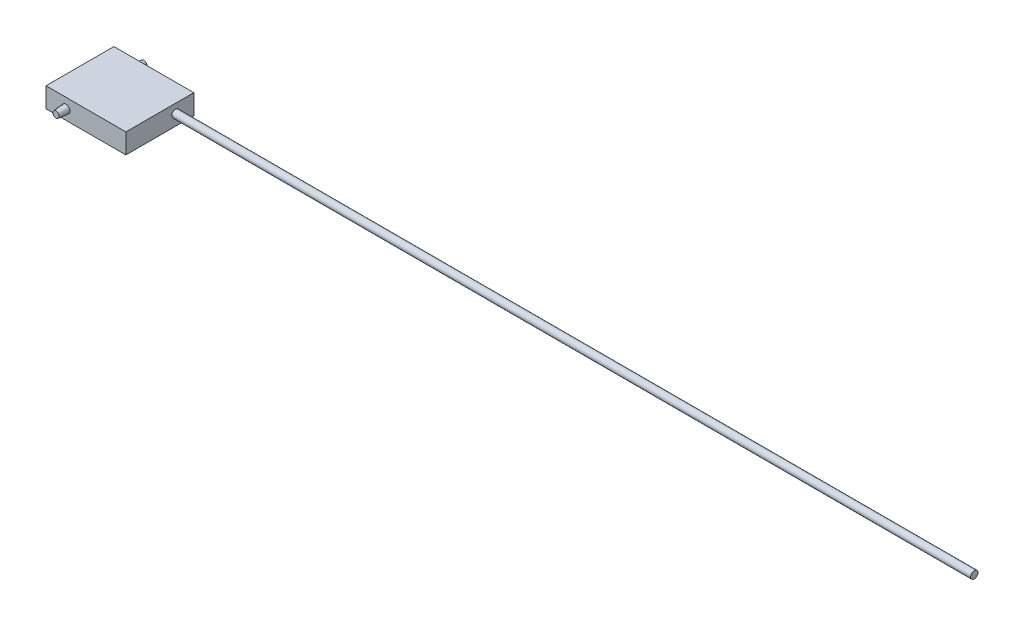
ISO-10303-21;
HEADER;
FILE_DESCRIPTION(('STEP AP214'),'2;1');
FILE_NAME('part.step','',(''),(''),'','','');
FILE_SCHEMA(('AUTOMOTIVE_DESIGN { 1 0 10303 214 1 1 1 1 }'));
ENDSEC;
DATA;
#1=APPLICATION_CONTEXT('core data for automotive mechanical design processes');
#2=APPLICATION_PROTOCOL_DEFINITION('international standard','automotive_design',2000,#1);
#3=PRODUCT_CONTEXT('',#1,'mechanical');
#4=PRODUCT('Part','Part','',(#3));
#5=PRODUCT_RELATED_PRODUCT_CATEGORY('part','',(#4));
#6=PRODUCT_DEFINITION_FORMATION('','',#4);
#7=PRODUCT_DEFINITION_CONTEXT('part definition',#1,'design');
#8=PRODUCT_DEFINITION('design','',#6,#7);
#9=PRODUCT_DEFINITION_SHAPE('','',#8);
#10=(LENGTH_UNIT() NAMED_UNIT(*) SI_UNIT(.MILLI.,.METRE.));
#11=(NAMED_UNIT(*) PLANE_ANGLE_UNIT() SI_UNIT($,.RADIAN.));
#12=(NAMED_UNIT(*) SI_UNIT($,.STERADIAN.) SOLID_ANGLE_UNIT());
#13=UNCERTAINTY_MEASURE_WITH_UNIT(LENGTH_MEASURE(1.E-05),#10,'distance_accuracy_value','');
#14=(GEOMETRIC_REPRESENTATION_CONTEXT(3) GLOBAL_UNCERTAINTY_ASSIGNED_CONTEXT((#13)) GLOBAL_UNIT_ASSIGNED_CONTEXT((#10,
#11,#12)) REPRESENTATION_CONTEXT('',''));
#15=CARTESIAN_POINT('',(0.,0.,0.));
#16=DIRECTION('',(0.,0.,1.));
#17=DIRECTION('',(1.,0.,0.));
#18=AXIS2_PLACEMENT_3D('',#15,#16,#17);
#19=CARTESIAN_POINT('',(12.7,6.35,10.795));
#20=DIRECTION('',(-1.,0.,0.));
#21=DIRECTION('',(0.,0.,1.));
#22=AXIS2_PLACEMENT_3D('',#19,#20,#21);
#23=PLANE('',#22);
#24=CARTESIAN_POINT('',(12.7,3.54999999999917,-4.95638753255173));
#25=DIRECTION('',(-1.,0.,0.));
#26=DIRECTION('',(0.,0.,1.));
#27=AXIS2_PLACEMENT_3D('',#24,#25,#26);
#28=CIRCLE('',#27,1.16904573914205);
#29=CARTESIAN_POINT('',(12.7,3.54999999999917,-3.78734179340968));
#30=VERTEX_POINT('',#29);
#31=EDGE_CURVE('E11',#30,#30,#28,.F.);
#32=ORIENTED_EDGE('',*,*,#31,.F.);
#33=EDGE_LOOP('',(#32));
#34=FACE_BOUND('',#33,.T.);
#35=DIRECTION('',(0.,0.,-1.));
#36=VECTOR('',#35,1.);
#37=CARTESIAN_POINT('',(12.7,0.,10.795));
#38=LINE('',#37,#36);
#39=CARTESIAN_POINT('',(12.7,0.,10.795));
#40=VERTEX_POINT('',#39);
#41=CARTESIAN_POINT('',(12.7,0.,-10.795));
#42=VERTEX_POINT('',#41);
#43=EDGE_CURVE('E100',#40,#42,#38,.T.);
#44=ORIENTED_EDGE('',*,*,#43,.T.);
#45=DIRECTION('',(0.,-1.,0.));
#46=VECTOR('',#45,1.);
#47=CARTESIAN_POINT('',(12.7,6.35,-10.795));
#48=LINE('',#47,#46);
#49=CARTESIAN_POINT('',(12.7,6.35,-10.795));
#50=VERTEX_POINT('',#49);
#51=EDGE_CURVE('E91',#50,#42,#48,.T.);
#52=ORIENTED_EDGE('',*,*,#51,.F.);
#53=DIRECTION('',(0.,0.,-1.));
#54=VECTOR('',#53,1.);
#55=CARTESIAN_POINT('',(12.7,6.35,10.795));
#56=LINE('',#55,#54);
#57=CARTESIAN_POINT('',(12.7,6.35,10.795));
#58=VERTEX_POINT('',#57);
#59=EDGE_CURVE('E85',#58,#50,#56,.T.);
#60=ORIENTED_EDGE('',*,*,#59,.F.);
#61=DIRECTION('',(0.,-1.,0.));
#62=VECTOR('',#61,1.);
#63=CARTESIAN_POINT('',(12.7,6.35,10.795));
#64=LINE('',#63,#62);
#65=EDGE_CURVE('E96',#58,#40,#64,.T.);
#66=ORIENTED_EDGE('',*,*,#65,.T.);
#67=EDGE_LOOP('',(#44,#52,#60,#66));
#68=FACE_BOUND('',#67,.T.);
#69=ADVANCED_FACE('F33',(#34,#68),#23,.F.);
#70=CARTESIAN_POINT('',(-12.7,6.35,-10.795));
#71=DIRECTION('',(0.,0.,1.));
#72=DIRECTION('',(1.,0.,0.));
#73=AXIS2_PLACEMENT_3D('',#70,#71,#72);
#74=PLANE('',#73);
#75=CARTESIAN_POINT('',(-6.35,3.175,-10.795));
#76=DIRECTION('',(0.,0.,1.));
#77=DIRECTION('',(1.,0.,0.));
#78=AXIS2_PLACEMENT_3D('',#75,#76,#77);
#79=CIRCLE('',#78,1.27);
#80=CARTESIAN_POINT('',(-5.08,3.175,-10.795));
#81=VERTEX_POINT('',#80);
#82=EDGE_CURVE('E166',#81,#81,#79,.T.);
#83=ORIENTED_EDGE('',*,*,#82,.T.);
#84=EDGE_LOOP('',(#83));
#85=FACE_BOUND('',#84,.T.);
#86=DIRECTION('',(-1.,0.,0.));
#87=VECTOR('',#86,1.);
#88=CARTESIAN_POINT('',(-12.7,0.,-10.795));
#89=LINE('',#88,#87);
#90=CARTESIAN_POINT('',(-12.7,0.,-10.795));
#91=VERTEX_POINT('',#90);
#92=EDGE_CURVE('E90',#42,#91,#89,.T.);
#93=ORIENTED_EDGE('',*,*,#92,.T.);
#94=DIRECTION('',(0.,-1.,0.));
#95=VECTOR('',#94,1.);
#96=CARTESIAN_POINT('',(-12.7,6.35,-10.795));
#97=LINE('',#96,#95);
#98=CARTESIAN_POINT('',(-12.7,6.35,-10.795));
#99=VERTEX_POINT('',#98);
#100=EDGE_CURVE('E88',#99,#91,#97,.T.);
#101=ORIENTED_EDGE('',*,*,#100,.F.);
#102=DIRECTION('',(-1.,0.,0.));
#103=VECTOR('',#102,1.);
#104=CARTESIAN_POINT('',(-12.7,6.35,-10.795));
#105=LINE('',#104,#103);
#106=EDGE_CURVE('E80',#50,#99,#105,.T.);
#107=ORIENTED_EDGE('',*,*,#106,.F.);
#108=ORIENTED_EDGE('',*,*,#51,.T.);
#109=EDGE_LOOP('',(#93,#101,#107,#108));
#110=FACE_BOUND('',#109,.T.);
#111=ADVANCED_FACE('F89',(#85,#110),#74,.F.);
#112=CARTESIAN_POINT('',(-12.7,6.35,10.795));
#113=DIRECTION('',(1.,0.,0.));
#114=DIRECTION('',(0.,0.,-1.));
#115=AXIS2_PLACEMENT_3D('',#112,#113,#114);
#116=PLANE('',#115);
#117=DIRECTION('',(0.,0.,1.));
#118=VECTOR('',#117,1.);
#119=CARTESIAN_POINT('',(-12.7,0.,10.795));
#120=LINE('',#119,#118);
#121=CARTESIAN_POINT('',(-12.7,0.,10.795));
#122=VERTEX_POINT('',#121);
#123=EDGE_CURVE('E66',#91,#122,#120,.T.);
#124=ORIENTED_EDGE('',*,*,#123,.T.);
#125=DIRECTION('',(0.,-1.,0.));
#126=VECTOR('',#125,1.);
#127=CARTESIAN_POINT('',(-12.7,6.35,10.795));
#128=LINE('',#127,#126);
#129=CARTESIAN_POINT('',(-12.7,6.35,10.795));
#130=VERTEX_POINT('',#129);
#131=EDGE_CURVE('E92',#130,#122,#128,.T.);
#132=ORIENTED_EDGE('',*,*,#131,.F.);
#133=DIRECTION('',(0.,0.,1.));
#134=VECTOR('',#133,1.);
#135=CARTESIAN_POINT('',(-12.7,6.35,10.795));
#136=LINE('',#135,#134);
#137=EDGE_CURVE('E83',#99,#130,#136,.T.);
#138=ORIENTED_EDGE('',*,*,#137,.F.);
#139=ORIENTED_EDGE('',*,*,#100,.T.);
#140=EDGE_LOOP('',(#124,#132,#138,#139));
#141=FACE_BOUND('',#140,.T.);
#142=ADVANCED_FACE('F94',(#141),#116,.F.);
#143=CARTESIAN_POINT('',(-12.7,6.35,10.795));
#144=DIRECTION('',(0.,0.,-1.));
#145=DIRECTION('',(-1.,0.,0.));
#146=AXIS2_PLACEMENT_3D('',#143,#144,#145);
#147=PLANE('',#146);
#148=CARTESIAN_POINT('',(-6.35,3.175,10.795));
#149=DIRECTION('',(0.,0.,-1.));
#150=DIRECTION('',(-1.,0.,0.));
#151=AXIS2_PLACEMENT_3D('',#148,#149,#150);
#152=CIRCLE('',#151,1.27);
#153=CARTESIAN_POINT('',(-7.62,3.175,10.795));
#154=VERTEX_POINT('',#153);
#155=EDGE_CURVE('E41',#154,#154,#152,.F.);
#156=ORIENTED_EDGE('',*,*,#155,.F.);
#157=EDGE_LOOP('',(#156));
#158=FACE_BOUND('',#157,.T.);
#159=DIRECTION('',(1.,0.,0.));
#160=VECTOR('',#159,1.);
#161=CARTESIAN_POINT('',(-12.7,0.,10.795));
#162=LINE('',#161,#160);
#163=EDGE_CURVE('E72',#122,#40,#162,.T.);
#164=ORIENTED_EDGE('',*,*,#163,.T.);
#165=ORIENTED_EDGE('',*,*,#65,.F.);
#166=DIRECTION('',(1.,0.,0.));
#167=VECTOR('',#166,1.);
#168=CARTESIAN_POINT('',(-12.7,6.35,10.795));
#169=LINE('',#168,#167);
#170=EDGE_CURVE('E49',#130,#58,#169,.T.);
#171=ORIENTED_EDGE('',*,*,#170,.F.);
#172=ORIENTED_EDGE('',*,*,#131,.T.);
#173=EDGE_LOOP('',(#164,#165,#171,#172));
#174=FACE_BOUND('',#173,.T.);
#175=ADVANCED_FACE('F114',(#158,#174),#147,.F.);
#176=CARTESIAN_POINT('',(0.,6.35,0.));
#177=DIRECTION('',(0.,-1.,0.));
#178=DIRECTION('',(0.,0.,-1.));
#179=AXIS2_PLACEMENT_3D('',#176,#177,#178);
#180=PLANE('',#179);
#181=ORIENTED_EDGE('',*,*,#59,.T.);
#182=ORIENTED_EDGE('',*,*,#106,.T.);
#183=ORIENTED_EDGE('',*,*,#137,.T.);
#184=ORIENTED_EDGE('',*,*,#170,.T.);
#185=EDGE_LOOP('',(#181,#182,#183,#184));
#186=FACE_BOUND('',#185,.T.);
#187=ADVANCED_FACE('F81',(#186),#180,.F.);
#188=CARTESIAN_POINT('',(0.,0.,0.));
#189=DIRECTION('',(0.,-1.,0.));
#190=DIRECTION('',(0.,0.,-1.));
#191=AXIS2_PLACEMENT_3D('',#188,#189,#190);
#192=PLANE('',#191);
#193=ORIENTED_EDGE('',*,*,#43,.F.);
#194=ORIENTED_EDGE('',*,*,#163,.F.);
#195=ORIENTED_EDGE('',*,*,#123,.F.);
#196=ORIENTED_EDGE('',*,*,#92,.F.);
#197=EDGE_LOOP('',(#193,#194,#195,#196));
#198=FACE_BOUND('',#197,.T.);
#199=ADVANCED_FACE('F121',(#198),#192,.T.);
#200=CARTESIAN_POINT('',(-6.35,3.175,10.795));
#201=DIRECTION('',(0.,0.,-1.));
#202=DIRECTION('',(1.,0.,0.));
#203=AXIS2_PLACEMENT_3D('',#200,#201,#202);
#204=CONICAL_SURFACE('',#203,1.27,0.0872664625997167);
#205=CARTESIAN_POINT('',(-6.35,3.175,13.97));
#206=DIRECTION('',(0.,0.,1.));
#207=DIRECTION('',(1.,0.,0.));
#208=AXIS2_PLACEMENT_3D('',#205,#206,#207);
#209=CIRCLE('',#208,0.992223493305191);
#210=CARTESIAN_POINT('',(-5.35777650669481,3.175,13.97));
#211=VERTEX_POINT('',#210);
#212=EDGE_CURVE('E103',#211,#211,#209,.T.);
#213=ORIENTED_EDGE('',*,*,#212,.F.);
#214=EDGE_LOOP('',(#213));
#215=FACE_BOUND('',#214,.T.);
#216=ORIENTED_EDGE('',*,*,#155,.T.);
#217=EDGE_LOOP('',(#216));
#218=FACE_BOUND('',#217,.T.);
#219=ADVANCED_FACE('F112',(#215,#218),#204,.T.);
#220=CARTESIAN_POINT('',(-6.35,3.175,13.97));
#221=DIRECTION('',(0.,0.,1.));
#222=DIRECTION('',(1.,0.,0.));
#223=AXIS2_PLACEMENT_3D('',#220,#221,#222);
#224=PLANE('',#223);
#225=ORIENTED_EDGE('',*,*,#212,.T.);
#226=EDGE_LOOP('',(#225));
#227=FACE_BOUND('',#226,.T.);
#228=ADVANCED_FACE('F139',(#227),#224,.T.);
#229=CARTESIAN_POINT('',(-6.35,3.175,-10.795));
#230=DIRECTION('',(0.,0.,1.));
#231=DIRECTION('',(1.,0.,0.));
#232=AXIS2_PLACEMENT_3D('',#229,#230,#231);
#233=CONICAL_SURFACE('',#232,1.27,0.0872664625997167);
#234=CARTESIAN_POINT('',(-6.35,3.175,-13.97));
#235=DIRECTION('',(0.,0.,-1.));
#236=DIRECTION('',(-1.,0.,0.));
#237=AXIS2_PLACEMENT_3D('',#234,#235,#236);
#238=CIRCLE('',#237,0.992223493305191);
#239=CARTESIAN_POINT('',(-7.34222349330519,3.175,-13.97));
#240=VERTEX_POINT('',#239);
#241=EDGE_CURVE('E169',#240,#240,#238,.F.);
#242=ORIENTED_EDGE('',*,*,#241,.T.);
#243=EDGE_LOOP('',(#242));
#244=FACE_BOUND('',#243,.T.);
#245=ORIENTED_EDGE('',*,*,#82,.F.);
#246=EDGE_LOOP('',(#245));
#247=FACE_BOUND('',#246,.T.);
#248=ADVANCED_FACE('F145',(#244,#247),#233,.T.);
#249=CARTESIAN_POINT('',(-6.35,3.175,-13.97));
#250=DIRECTION('',(0.,0.,-1.));
#251=DIRECTION('',(1.,0.,0.));
#252=AXIS2_PLACEMENT_3D('',#249,#250,#251);
#253=PLANE('',#252);
#254=ORIENTED_EDGE('',*,*,#241,.F.);
#255=EDGE_LOOP('',(#254));
#256=FACE_BOUND('',#255,.T.);
#257=ADVANCED_FACE('F149',(#256),#253,.T.);
#258=CARTESIAN_POINT('',(266.7,3.54999999999917,-4.95638753255173));
#259=DIRECTION('',(-1.,0.,0.));
#260=DIRECTION('',(0.,0.,1.));
#261=AXIS2_PLACEMENT_3D('',#258,#259,#260);
#262=CYLINDRICAL_SURFACE('',#261,1.16904573914205);
#263=CARTESIAN_POINT('',(266.7,3.54999999999917,-4.95638753255173));
#264=DIRECTION('',(1.,0.,0.));
#265=DIRECTION('',(0.,0.,-1.));
#266=AXIS2_PLACEMENT_3D('',#263,#264,#265);
#267=CIRCLE('',#266,1.16904573914205);
#268=CARTESIAN_POINT('',(266.7,3.54999999999917,-6.12543327169378));
#269=VERTEX_POINT('',#268);
#270=EDGE_CURVE('E165',#269,#269,#267,.T.);
#271=ORIENTED_EDGE('',*,*,#270,.F.);
#272=EDGE_LOOP('',(#271));
#273=FACE_BOUND('',#272,.T.);
#274=ORIENTED_EDGE('',*,*,#31,.T.);
#275=EDGE_LOOP('',(#274));
#276=FACE_BOUND('',#275,.T.);
#277=ADVANCED_FACE('F153',(#273,#276),#262,.T.);
#278=CARTESIAN_POINT('',(266.7,3.54999999999917,-4.95638753255173));
#279=DIRECTION('',(1.,0.,0.));
#280=DIRECTION('',(0.,0.,-1.));
#281=AXIS2_PLACEMENT_3D('',#278,#279,#280);
#282=PLANE('',#281);
#283=ORIENTED_EDGE('',*,*,#270,.T.);
#284=EDGE_LOOP('',(#283));
#285=FACE_BOUND('',#284,.T.);
#286=ADVANCED_FACE('F157',(#285),#282,.T.);
#287=CLOSED_SHELL('',(#69,#111,#142,#175,#187,#199,#219,#228,#248,#257,#277,#286));
#288=MANIFOLD_SOLID_BREP('B2',#287);
#289=ADVANCED_BREP_SHAPE_REPRESENTATION('',(#18,#288),#14);
#290=SHAPE_DEFINITION_REPRESENTATION(#9,#289);
ENDSEC;
END-ISO-10303-21;
